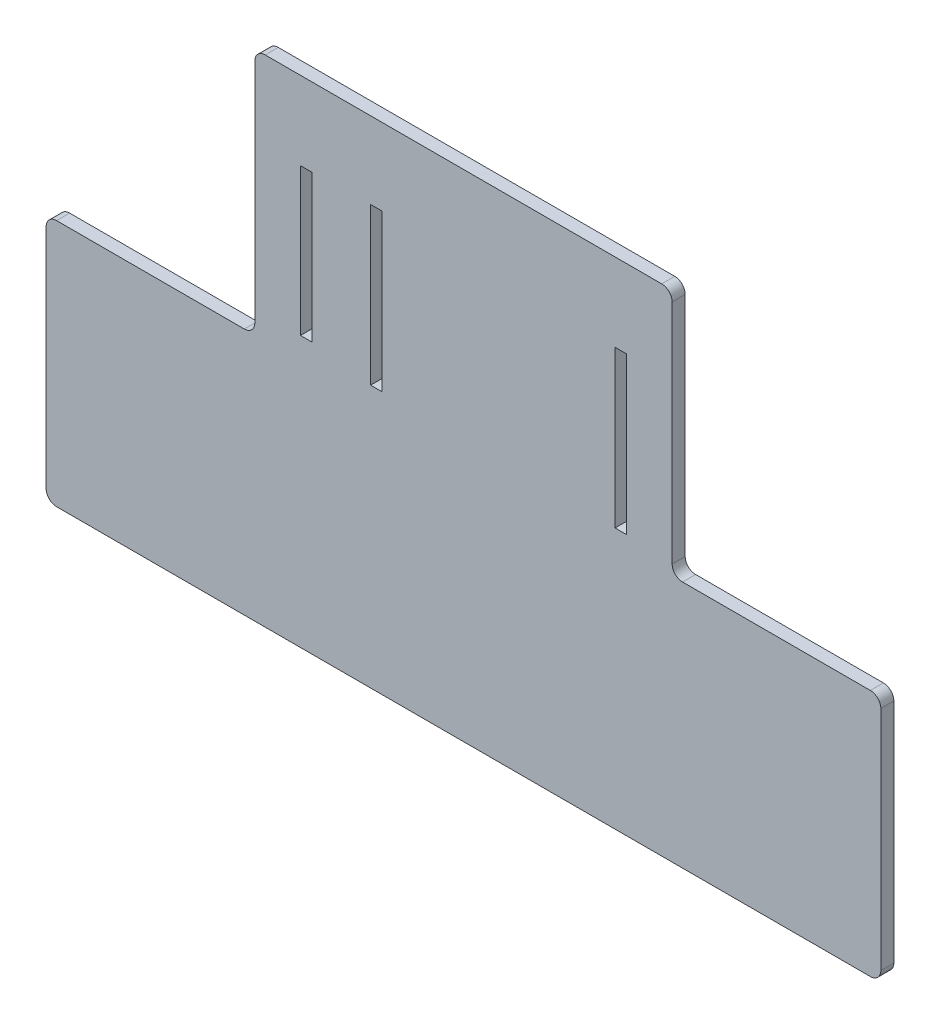
ISO-10303-21;
HEADER;
FILE_DESCRIPTION(('STEP AP214'),'2;1');
FILE_NAME('part.step','',(''),(''),'','','');
FILE_SCHEMA(('AUTOMOTIVE_DESIGN { 1 0 10303 214 1 1 1 1 }'));
ENDSEC;
DATA;
#1=APPLICATION_CONTEXT('core data for automotive mechanical design processes');
#2=APPLICATION_PROTOCOL_DEFINITION('international standard','automotive_design',2000,#1);
#3=PRODUCT_CONTEXT('',#1,'mechanical');
#4=PRODUCT('Part','Part','',(#3));
#5=PRODUCT_RELATED_PRODUCT_CATEGORY('part','',(#4));
#6=PRODUCT_DEFINITION_FORMATION('','',#4);
#7=PRODUCT_DEFINITION_CONTEXT('part definition',#1,'design');
#8=PRODUCT_DEFINITION('design','',#6,#7);
#9=PRODUCT_DEFINITION_SHAPE('','',#8);
#10=(LENGTH_UNIT() NAMED_UNIT(*) SI_UNIT(.MILLI.,.METRE.));
#11=(NAMED_UNIT(*) PLANE_ANGLE_UNIT() SI_UNIT($,.RADIAN.));
#12=(NAMED_UNIT(*) SI_UNIT($,.STERADIAN.) SOLID_ANGLE_UNIT());
#13=UNCERTAINTY_MEASURE_WITH_UNIT(LENGTH_MEASURE(1.E-05),#10,'distance_accuracy_value','');
#14=(GEOMETRIC_REPRESENTATION_CONTEXT(3) GLOBAL_UNCERTAINTY_ASSIGNED_CONTEXT((#13)) GLOBAL_UNIT_ASSIGNED_CONTEXT((#10,
#11,#12)) REPRESENTATION_CONTEXT('',''));
#15=CARTESIAN_POINT('',(0.,0.,0.));
#16=DIRECTION('',(0.,0.,1.));
#17=DIRECTION('',(1.,0.,0.));
#18=AXIS2_PLACEMENT_3D('',#15,#16,#17);
#19=CARTESIAN_POINT('',(-123.965152729372,23.4645021645021,3.175));
#20=DIRECTION('',(1.,0.,0.));
#21=DIRECTION('',(0.,1.,0.));
#22=AXIS2_PLACEMENT_3D('',#19,#20,#21);
#23=PLANE('',#22);
#24=DIRECTION('',(0.,-1.,0.));
#25=VECTOR('',#24,1.);
#26=CARTESIAN_POINT('',(-123.965152729372,23.4645021645021,3.175));
#27=LINE('',#26,#25);
#28=CARTESIAN_POINT('',(-123.965152729372,20.9245021645021,3.175));
#29=VERTEX_POINT('',#28);
#30=CARTESIAN_POINT('',(-123.965152729372,-34.3204978354978,3.175));
#31=VERTEX_POINT('',#30);
#32=EDGE_CURVE('E307',#29,#31,#27,.T.);
#33=ORIENTED_EDGE('',*,*,#32,.F.);
#34=DIRECTION('',(0.,0.,-1.));
#35=VECTOR('',#34,1.);
#36=CARTESIAN_POINT('',(-123.965152729372,20.9245021645021,3.175));
#37=LINE('',#36,#35);
#38=CARTESIAN_POINT('',(-123.965152729372,20.9245021645021,0.));
#39=VERTEX_POINT('',#38);
#40=EDGE_CURVE('E395',#29,#39,#37,.T.);
#41=ORIENTED_EDGE('',*,*,#40,.T.);
#42=DIRECTION('',(0.,-1.,0.));
#43=VECTOR('',#42,1.);
#44=CARTESIAN_POINT('',(-123.965152729372,23.4645021645021,0.));
#45=LINE('',#44,#43);
#46=CARTESIAN_POINT('',(-123.965152729372,-34.3204978354978,0.));
#47=VERTEX_POINT('',#46);
#48=EDGE_CURVE('E300',#39,#47,#45,.T.);
#49=ORIENTED_EDGE('',*,*,#48,.T.);
#50=DIRECTION('',(0.,0.,-1.));
#51=VECTOR('',#50,1.);
#52=CARTESIAN_POINT('',(-123.965152729372,-34.3204978354978,3.175));
#53=LINE('',#52,#51);
#54=EDGE_CURVE('E393',#47,#31,#53,.F.);
#55=ORIENTED_EDGE('',*,*,#54,.T.);
#56=EDGE_LOOP('',(#33,#41,#49,#55));
#57=FACE_BOUND('',#56,.T.);
#58=ADVANCED_FACE('F33',(#57),#23,.F.);
#59=CARTESIAN_POINT('',(-123.965152729372,-36.8604978354979,3.175));
#60=DIRECTION('',(0.,1.,0.));
#61=DIRECTION('',(-1.,0.,0.));
#62=AXIS2_PLACEMENT_3D('',#59,#60,#61);
#63=PLANE('',#62);
#64=DIRECTION('',(1.,0.,0.));
#65=VECTOR('',#64,1.);
#66=CARTESIAN_POINT('',(-123.965152729372,-36.8604978354979,3.175));
#67=LINE('',#66,#65);
#68=CARTESIAN_POINT('',(-121.425152729372,-36.8604978354979,3.175));
#69=VERTEX_POINT('',#68);
#70=CARTESIAN_POINT('',(76.6948472706281,-36.8604978354979,3.175));
#71=VERTEX_POINT('',#70);
#72=EDGE_CURVE('E310',#69,#71,#67,.T.);
#73=ORIENTED_EDGE('',*,*,#72,.F.);
#74=DIRECTION('',(0.,0.,-1.));
#75=VECTOR('',#74,1.);
#76=CARTESIAN_POINT('',(-121.425152729372,-36.8604978354979,3.175));
#77=LINE('',#76,#75);
#78=CARTESIAN_POINT('',(-121.425152729372,-36.8604978354979,0.));
#79=VERTEX_POINT('',#78);
#80=EDGE_CURVE('E400',#69,#79,#77,.T.);
#81=ORIENTED_EDGE('',*,*,#80,.T.);
#82=DIRECTION('',(1.,0.,0.));
#83=VECTOR('',#82,1.);
#84=CARTESIAN_POINT('',(-123.965152729372,-36.8604978354979,0.));
#85=LINE('',#84,#83);
#86=CARTESIAN_POINT('',(76.6948472706281,-36.8604978354979,0.));
#87=VERTEX_POINT('',#86);
#88=EDGE_CURVE('E335',#79,#87,#85,.T.);
#89=ORIENTED_EDGE('',*,*,#88,.T.);
#90=DIRECTION('',(0.,0.,-1.));
#91=VECTOR('',#90,1.);
#92=CARTESIAN_POINT('',(76.6948472706281,-36.8604978354979,3.175));
#93=LINE('',#92,#91);
#94=EDGE_CURVE('E398',#87,#71,#93,.F.);
#95=ORIENTED_EDGE('',*,*,#94,.T.);
#96=EDGE_LOOP('',(#73,#81,#89,#95));
#97=FACE_BOUND('',#96,.T.);
#98=ADVANCED_FACE('F463',(#97),#63,.F.);
#99=CARTESIAN_POINT('',(79.2348472706281,23.4645021645021,3.175));
#100=DIRECTION('',(-1.,0.,0.));
#101=DIRECTION('',(0.,-1.,0.));
#102=AXIS2_PLACEMENT_3D('',#99,#100,#101);
#103=PLANE('',#102);
#104=DIRECTION('',(0.,1.,0.));
#105=VECTOR('',#104,1.);
#106=CARTESIAN_POINT('',(79.2348472706281,23.4645021645021,3.175));
#107=LINE('',#106,#105);
#108=CARTESIAN_POINT('',(79.2348472706281,-34.3204978354978,3.175));
#109=VERTEX_POINT('',#108);
#110=CARTESIAN_POINT('',(79.2348472706281,20.9245021645021,3.175));
#111=VERTEX_POINT('',#110);
#112=EDGE_CURVE('E314',#109,#111,#107,.T.);
#113=ORIENTED_EDGE('',*,*,#112,.F.);
#114=DIRECTION('',(0.,0.,-1.));
#115=VECTOR('',#114,1.);
#116=CARTESIAN_POINT('',(79.2348472706281,-34.3204978354979,3.175));
#117=LINE('',#116,#115);
#118=CARTESIAN_POINT('',(79.2348472706281,-34.3204978354978,0.));
#119=VERTEX_POINT('',#118);
#120=EDGE_CURVE('E405',#109,#119,#117,.T.);
#121=ORIENTED_EDGE('',*,*,#120,.T.);
#122=DIRECTION('',(0.,1.,0.));
#123=VECTOR('',#122,1.);
#124=CARTESIAN_POINT('',(79.2348472706281,23.4645021645021,0.));
#125=LINE('',#124,#123);
#126=CARTESIAN_POINT('',(79.2348472706281,20.9245021645021,0.));
#127=VERTEX_POINT('',#126);
#128=EDGE_CURVE('E338',#119,#127,#125,.T.);
#129=ORIENTED_EDGE('',*,*,#128,.T.);
#130=DIRECTION('',(0.,0.,-1.));
#131=VECTOR('',#130,1.);
#132=CARTESIAN_POINT('',(79.2348472706281,20.9245021645021,3.175));
#133=LINE('',#132,#131);
#134=EDGE_CURVE('E403',#127,#111,#133,.F.);
#135=ORIENTED_EDGE('',*,*,#134,.T.);
#136=EDGE_LOOP('',(#113,#121,#129,#135));
#137=FACE_BOUND('',#136,.T.);
#138=ADVANCED_FACE('F469',(#137),#103,.F.);
#139=CARTESIAN_POINT('',(28.4348472706281,23.4645021645021,3.175));
#140=DIRECTION('',(0.,-1.,0.));
#141=DIRECTION('',(1.,0.,0.));
#142=AXIS2_PLACEMENT_3D('',#139,#140,#141);
#143=PLANE('',#142);
#144=DIRECTION('',(-1.,0.,0.));
#145=VECTOR('',#144,1.);
#146=CARTESIAN_POINT('',(28.4348472706281,23.4645021645021,0.));
#147=LINE('',#146,#145);
#148=CARTESIAN_POINT('',(76.6948472706281,23.4645021645021,0.));
#149=VERTEX_POINT('',#148);
#150=CARTESIAN_POINT('',(30.9748472706281,23.4645021645021,0.));
#151=VERTEX_POINT('',#150);
#152=EDGE_CURVE('E341',#149,#151,#147,.T.);
#153=ORIENTED_EDGE('',*,*,#152,.T.);
#154=DIRECTION('',(0.,0.,-1.));
#155=VECTOR('',#154,1.);
#156=CARTESIAN_POINT('',(30.9748472706281,23.4645021645021,3.175));
#157=LINE('',#156,#155);
#158=CARTESIAN_POINT('',(30.9748472706281,23.4645021645021,3.175));
#159=VERTEX_POINT('',#158);
#160=EDGE_CURVE('E416',#151,#159,#157,.F.);
#161=ORIENTED_EDGE('',*,*,#160,.T.);
#162=DIRECTION('',(-1.,0.,0.));
#163=VECTOR('',#162,1.);
#164=CARTESIAN_POINT('',(28.4348472706281,23.4645021645021,3.175));
#165=LINE('',#164,#163);
#166=CARTESIAN_POINT('',(76.6948472706281,23.4645021645021,3.175));
#167=VERTEX_POINT('',#166);
#168=EDGE_CURVE('E317',#167,#159,#165,.T.);
#169=ORIENTED_EDGE('',*,*,#168,.F.);
#170=DIRECTION('',(0.,0.,-1.));
#171=VECTOR('',#170,1.);
#172=CARTESIAN_POINT('',(76.6948472706281,23.4645021645021,3.175));
#173=LINE('',#172,#171);
#174=EDGE_CURVE('E413',#167,#149,#173,.T.);
#175=ORIENTED_EDGE('',*,*,#174,.T.);
#176=EDGE_LOOP('',(#153,#161,#169,#175));
#177=FACE_BOUND('',#176,.T.);
#178=ADVANCED_FACE('F514',(#177),#143,.F.);
#179=CARTESIAN_POINT('',(28.4348472706281,83.7895021645021,3.175));
#180=DIRECTION('',(-1.,0.,0.));
#181=DIRECTION('',(0.,0.,1.));
#182=AXIS2_PLACEMENT_3D('',#179,#180,#181);
#183=PLANE('',#182);
#184=DIRECTION('',(0.,1.,0.));
#185=VECTOR('',#184,1.);
#186=CARTESIAN_POINT('',(28.4348472706281,83.7895021645021,3.175));
#187=LINE('',#186,#185);
#188=CARTESIAN_POINT('',(28.4348472706281,26.0045021645021,3.175));
#189=VERTEX_POINT('',#188);
#190=CARTESIAN_POINT('',(28.4348472706281,81.2495021645021,3.175));
#191=VERTEX_POINT('',#190);
#192=EDGE_CURVE('E320',#189,#191,#187,.T.);
#193=ORIENTED_EDGE('',*,*,#192,.F.);
#194=DIRECTION('',(0.,0.,-1.));
#195=VECTOR('',#194,1.);
#196=CARTESIAN_POINT('',(28.4348472706281,26.0045021645021,0.));
#197=LINE('',#196,#195);
#198=CARTESIAN_POINT('',(28.4348472706281,26.0045021645021,0.));
#199=VERTEX_POINT('',#198);
#200=EDGE_CURVE('E410',#189,#199,#197,.T.);
#201=ORIENTED_EDGE('',*,*,#200,.T.);
#202=DIRECTION('',(0.,1.,0.));
#203=VECTOR('',#202,1.);
#204=CARTESIAN_POINT('',(28.4348472706281,83.7895021645021,0.));
#205=LINE('',#204,#203);
#206=CARTESIAN_POINT('',(28.4348472706281,81.2495021645021,0.));
#207=VERTEX_POINT('',#206);
#208=EDGE_CURVE('E344',#199,#207,#205,.T.);
#209=ORIENTED_EDGE('',*,*,#208,.T.);
#210=DIRECTION('',(0.,0.,-1.));
#211=VECTOR('',#210,1.);
#212=CARTESIAN_POINT('',(28.4348472706281,81.2495021645021,3.175));
#213=LINE('',#212,#211);
#214=EDGE_CURVE('E408',#207,#191,#213,.F.);
#215=ORIENTED_EDGE('',*,*,#214,.T.);
#216=EDGE_LOOP('',(#193,#201,#209,#215));
#217=FACE_BOUND('',#216,.T.);
#218=ADVANCED_FACE('F521',(#217),#183,.F.);
#219=CARTESIAN_POINT('',(-73.1651527293719,83.7895021645021,3.175));
#220=DIRECTION('',(0.,-1.,0.));
#221=DIRECTION('',(1.,0.,0.));
#222=AXIS2_PLACEMENT_3D('',#219,#220,#221);
#223=PLANE('',#222);
#224=DIRECTION('',(-1.,0.,0.));
#225=VECTOR('',#224,1.);
#226=CARTESIAN_POINT('',(-73.1651527293719,83.7895021645021,0.));
#227=LINE('',#226,#225);
#228=CARTESIAN_POINT('',(25.8948472706281,83.7895021645021,0.));
#229=VERTEX_POINT('',#228);
#230=CARTESIAN_POINT('',(-70.6251527293719,83.7895021645021,0.));
#231=VERTEX_POINT('',#230);
#232=EDGE_CURVE('E347',#229,#231,#227,.T.);
#233=ORIENTED_EDGE('',*,*,#232,.T.);
#234=DIRECTION('',(0.,0.,-1.));
#235=VECTOR('',#234,1.);
#236=CARTESIAN_POINT('',(-70.6251527293719,83.7895021645021,3.175));
#237=LINE('',#236,#235);
#238=CARTESIAN_POINT('',(-70.6251527293719,83.7895021645021,3.175));
#239=VERTEX_POINT('',#238);
#240=EDGE_CURVE('E379',#231,#239,#237,.F.);
#241=ORIENTED_EDGE('',*,*,#240,.T.);
#242=DIRECTION('',(-1.,0.,0.));
#243=VECTOR('',#242,1.);
#244=CARTESIAN_POINT('',(-73.1651527293719,83.7895021645021,3.175));
#245=LINE('',#244,#243);
#246=CARTESIAN_POINT('',(25.8948472706281,83.7895021645021,3.175));
#247=VERTEX_POINT('',#246);
#248=EDGE_CURVE('E323',#247,#239,#245,.T.);
#249=ORIENTED_EDGE('',*,*,#248,.F.);
#250=DIRECTION('',(0.,0.,-1.));
#251=VECTOR('',#250,1.);
#252=CARTESIAN_POINT('',(25.8948472706281,83.7895021645021,3.175));
#253=LINE('',#252,#251);
#254=EDGE_CURVE('E376',#247,#229,#253,.T.);
#255=ORIENTED_EDGE('',*,*,#254,.T.);
#256=EDGE_LOOP('',(#233,#241,#249,#255));
#257=FACE_BOUND('',#256,.T.);
#258=ADVANCED_FACE('F528',(#257),#223,.F.);
#259=CARTESIAN_POINT('',(-73.1651527293719,83.7895021645021,3.175));
#260=DIRECTION('',(1.,0.,0.));
#261=DIRECTION('',(0.,0.,-1.));
#262=AXIS2_PLACEMENT_3D('',#259,#260,#261);
#263=PLANE('',#262);
#264=DIRECTION('',(0.,-1.,0.));
#265=VECTOR('',#264,1.);
#266=CARTESIAN_POINT('',(-73.1651527293719,83.7895021645021,0.));
#267=LINE('',#266,#265);
#268=CARTESIAN_POINT('',(-73.1651527293719,81.2495021645021,0.));
#269=VERTEX_POINT('',#268);
#270=CARTESIAN_POINT('',(-73.1651527293719,26.0045021645022,0.));
#271=VERTEX_POINT('',#270);
#272=EDGE_CURVE('E350',#269,#271,#267,.T.);
#273=ORIENTED_EDGE('',*,*,#272,.T.);
#274=DIRECTION('',(0.,0.,-1.));
#275=VECTOR('',#274,1.);
#276=CARTESIAN_POINT('',(-73.1651527293719,26.0045021645021,3.175));
#277=LINE('',#276,#275);
#278=CARTESIAN_POINT('',(-73.1651527293719,26.0045021645022,3.175));
#279=VERTEX_POINT('',#278);
#280=EDGE_CURVE('E362',#271,#279,#277,.F.);
#281=ORIENTED_EDGE('',*,*,#280,.T.);
#282=DIRECTION('',(0.,-1.,0.));
#283=VECTOR('',#282,1.);
#284=CARTESIAN_POINT('',(-73.1651527293719,83.7895021645021,3.175));
#285=LINE('',#284,#283);
#286=CARTESIAN_POINT('',(-73.1651527293719,81.2495021645021,3.175));
#287=VERTEX_POINT('',#286);
#288=EDGE_CURVE('E326',#287,#279,#285,.T.);
#289=ORIENTED_EDGE('',*,*,#288,.F.);
#290=DIRECTION('',(0.,0.,-1.));
#291=VECTOR('',#290,1.);
#292=CARTESIAN_POINT('',(-73.1651527293719,81.2495021645021,3.175));
#293=LINE('',#292,#291);
#294=EDGE_CURVE('E359',#287,#269,#293,.T.);
#295=ORIENTED_EDGE('',*,*,#294,.T.);
#296=EDGE_LOOP('',(#273,#281,#289,#295));
#297=FACE_BOUND('',#296,.T.);
#298=ADVANCED_FACE('F535',(#297),#263,.F.);
#299=CARTESIAN_POINT('',(-123.965152729372,23.4645021645021,3.175));
#300=DIRECTION('',(0.,-1.,0.));
#301=DIRECTION('',(0.,0.,-1.));
#302=AXIS2_PLACEMENT_3D('',#299,#300,#301);
#303=PLANE('',#302);
#304=DIRECTION('',(-1.,0.,0.));
#305=VECTOR('',#304,1.);
#306=CARTESIAN_POINT('',(-123.965152729372,23.4645021645021,3.175));
#307=LINE('',#306,#305);
#308=CARTESIAN_POINT('',(-75.7051527293719,23.4645021645021,3.175));
#309=VERTEX_POINT('',#308);
#310=CARTESIAN_POINT('',(-121.425152729372,23.4645021645021,3.175));
#311=VERTEX_POINT('',#310);
#312=EDGE_CURVE('E329',#309,#311,#307,.T.);
#313=ORIENTED_EDGE('',*,*,#312,.F.);
#314=DIRECTION('',(0.,0.,-1.));
#315=VECTOR('',#314,1.);
#316=CARTESIAN_POINT('',(-75.7051527293719,23.4645021645021,0.));
#317=LINE('',#316,#315);
#318=CARTESIAN_POINT('',(-75.7051527293719,23.4645021645021,0.));
#319=VERTEX_POINT('',#318);
#320=EDGE_CURVE('E356',#309,#319,#317,.T.);
#321=ORIENTED_EDGE('',*,*,#320,.T.);
#322=DIRECTION('',(-1.,0.,0.));
#323=VECTOR('',#322,1.);
#324=CARTESIAN_POINT('',(-123.965152729372,23.4645021645021,0.));
#325=LINE('',#324,#323);
#326=CARTESIAN_POINT('',(-121.425152729372,23.4645021645021,0.));
#327=VERTEX_POINT('',#326);
#328=EDGE_CURVE('E311',#319,#327,#325,.T.);
#329=ORIENTED_EDGE('',*,*,#328,.T.);
#330=DIRECTION('',(0.,0.,-1.));
#331=VECTOR('',#330,1.);
#332=CARTESIAN_POINT('',(-121.425152729372,23.4645021645021,3.175));
#333=LINE('',#332,#331);
#334=EDGE_CURVE('E332',#327,#311,#333,.F.);
#335=ORIENTED_EDGE('',*,*,#334,.T.);
#336=EDGE_LOOP('',(#313,#321,#329,#335));
#337=FACE_BOUND('',#336,.T.);
#338=ADVANCED_FACE('F542',(#337),#303,.F.);
#339=CARTESIAN_POINT('',(0.,0.,3.175));
#340=DIRECTION('',(0.,0.,1.));
#341=DIRECTION('',(1.,0.,0.));
#342=AXIS2_PLACEMENT_3D('',#339,#340,#341);
#343=PLANE('',#342);
#344=DIRECTION('',(0.,-1.,0.));
#345=VECTOR('',#344,1.);
#346=CARTESIAN_POINT('',(-44.9711527293719,65.0975164356922,3.175));
#347=LINE('',#346,#345);
#348=CARTESIAN_POINT('',(-44.9711527293719,65.0975164356922,3.175));
#349=VERTEX_POINT('',#348);
#350=CARTESIAN_POINT('',(-44.9711527293719,26.9975164356922,3.175));
#351=VERTEX_POINT('',#350);
#352=EDGE_CURVE('E48',#349,#351,#347,.T.);
#353=ORIENTED_EDGE('',*,*,#352,.F.);
#354=DIRECTION('',(-1.,0.,0.));
#355=VECTOR('',#354,1.);
#356=CARTESIAN_POINT('',(-44.9711527293719,65.0975164356922,3.175));
#357=LINE('',#356,#355);
#358=CARTESIAN_POINT('',(-42.1771527293719,65.0975164356922,3.175));
#359=VERTEX_POINT('',#358);
#360=EDGE_CURVE('E236',#359,#349,#357,.T.);
#361=ORIENTED_EDGE('',*,*,#360,.F.);
#362=DIRECTION('',(0.,1.,0.));
#363=VECTOR('',#362,1.);
#364=CARTESIAN_POINT('',(-42.1771527293719,65.0975164356922,3.175));
#365=LINE('',#364,#363);
#366=CARTESIAN_POINT('',(-42.1771527293719,26.9975164356922,3.175));
#367=VERTEX_POINT('',#366);
#368=EDGE_CURVE('E239',#367,#359,#365,.T.);
#369=ORIENTED_EDGE('',*,*,#368,.F.);
#370=DIRECTION('',(1.,0.,0.));
#371=VECTOR('',#370,1.);
#372=CARTESIAN_POINT('',(-44.9711527293719,26.9975164356922,3.175));
#373=LINE('',#372,#371);
#374=EDGE_CURVE('E245',#351,#367,#373,.T.);
#375=ORIENTED_EDGE('',*,*,#374,.F.);
#376=EDGE_LOOP('',(#353,#361,#369,#375));
#377=FACE_BOUND('',#376,.T.);
#378=DIRECTION('',(0.,-1.,0.));
#379=VECTOR('',#378,1.);
#380=CARTESIAN_POINT('',(-62.0526527293719,28.9369294344677,3.175));
#381=LINE('',#380,#379);
#382=CARTESIAN_POINT('',(-62.0526527293719,64.7395021645021,3.175));
#383=VERTEX_POINT('',#382);
#384=CARTESIAN_POINT('',(-62.0526527293719,28.9369294344677,3.175));
#385=VERTEX_POINT('',#384);
#386=EDGE_CURVE('E251',#383,#385,#381,.T.);
#387=ORIENTED_EDGE('',*,*,#386,.F.);
#388=DIRECTION('',(-1.,0.,0.));
#389=VECTOR('',#388,1.);
#390=CARTESIAN_POINT('',(-62.0526527293719,64.7395021645021,3.175));
#391=LINE('',#390,#389);
#392=CARTESIAN_POINT('',(-59.2586527293719,64.7395021645021,3.175));
#393=VERTEX_POINT('',#392);
#394=EDGE_CURVE('E262',#393,#383,#391,.T.);
#395=ORIENTED_EDGE('',*,*,#394,.F.);
#396=DIRECTION('',(0.,1.,0.));
#397=VECTOR('',#396,1.);
#398=CARTESIAN_POINT('',(-59.2586527293719,28.9369294344677,3.175));
#399=LINE('',#398,#397);
#400=CARTESIAN_POINT('',(-59.2586527293719,28.9369294344677,3.175));
#401=VERTEX_POINT('',#400);
#402=EDGE_CURVE('E259',#401,#393,#399,.T.);
#403=ORIENTED_EDGE('',*,*,#402,.F.);
#404=DIRECTION('',(1.,0.,0.));
#405=VECTOR('',#404,1.);
#406=CARTESIAN_POINT('',(-62.0526527293719,28.9369294344677,3.175));
#407=LINE('',#406,#405);
#408=EDGE_CURVE('E256',#385,#401,#407,.T.);
#409=ORIENTED_EDGE('',*,*,#408,.F.);
#410=EDGE_LOOP('',(#387,#395,#403,#409));
#411=FACE_BOUND('',#410,.T.);
#412=DIRECTION('',(0.,-1.,0.));
#413=VECTOR('',#412,1.);
#414=CARTESIAN_POINT('',(14.5283472706281,64.7395021645021,3.175));
#415=LINE('',#414,#413);
#416=CARTESIAN_POINT('',(14.5283472706281,64.7395021645021,3.175));
#417=VERTEX_POINT('',#416);
#418=CARTESIAN_POINT('',(14.5283472706281,26.6395021645021,3.175));
#419=VERTEX_POINT('',#418);
#420=EDGE_CURVE('E268',#417,#419,#415,.T.);
#421=ORIENTED_EDGE('',*,*,#420,.F.);
#422=DIRECTION('',(-1.,0.,0.));
#423=VECTOR('',#422,1.);
#424=CARTESIAN_POINT('',(17.3223472706281,64.7395021645021,3.175));
#425=LINE('',#424,#423);
#426=CARTESIAN_POINT('',(17.3223472706281,64.7395021645021,3.175));
#427=VERTEX_POINT('',#426);
#428=EDGE_CURVE('E279',#427,#417,#425,.T.);
#429=ORIENTED_EDGE('',*,*,#428,.F.);
#430=DIRECTION('',(0.,1.,0.));
#431=VECTOR('',#430,1.);
#432=CARTESIAN_POINT('',(17.3223472706281,64.7395021645021,3.175));
#433=LINE('',#432,#431);
#434=CARTESIAN_POINT('',(17.3223472706281,26.6395021645021,3.175));
#435=VERTEX_POINT('',#434);
#436=EDGE_CURVE('E293',#435,#427,#433,.T.);
#437=ORIENTED_EDGE('',*,*,#436,.F.);
#438=DIRECTION('',(1.,0.,0.));
#439=VECTOR('',#438,1.);
#440=CARTESIAN_POINT('',(17.3223472706281,26.6395021645021,3.175));
#441=LINE('',#440,#439);
#442=EDGE_CURVE('E290',#419,#435,#441,.T.);
#443=ORIENTED_EDGE('',*,*,#442,.F.);
#444=EDGE_LOOP('',(#421,#429,#437,#443));
#445=FACE_BOUND('',#444,.T.);
#446=ORIENTED_EDGE('',*,*,#248,.T.);
#447=CARTESIAN_POINT('',(-70.6251527293719,81.2495021645021,3.175));
#448=DIRECTION('',(0.,0.,1.));
#449=DIRECTION('',(1.,0.,0.));
#450=AXIS2_PLACEMENT_3D('',#447,#448,#449);
#451=CIRCLE('',#450,2.54);
#452=EDGE_CURVE('E391',#239,#287,#451,.T.);
#453=ORIENTED_EDGE('',*,*,#452,.T.);
#454=ORIENTED_EDGE('',*,*,#288,.T.);
#455=CARTESIAN_POINT('',(-75.7051527293719,26.0045021645021,3.175));
#456=DIRECTION('',(0.,0.,1.));
#457=DIRECTION('',(1.,0.,0.));
#458=AXIS2_PLACEMENT_3D('',#455,#456,#457);
#459=CIRCLE('',#458,2.54);
#460=EDGE_CURVE('E420',#279,#309,#459,.F.);
#461=ORIENTED_EDGE('',*,*,#460,.T.);
#462=ORIENTED_EDGE('',*,*,#312,.T.);
#463=CARTESIAN_POINT('',(-121.425152729372,20.9245021645021,3.175));
#464=DIRECTION('',(0.,0.,1.));
#465=DIRECTION('',(1.,0.,0.));
#466=AXIS2_PLACEMENT_3D('',#463,#464,#465);
#467=CIRCLE('',#466,2.54);
#468=EDGE_CURVE('E389',#311,#29,#467,.T.);
#469=ORIENTED_EDGE('',*,*,#468,.T.);
#470=ORIENTED_EDGE('',*,*,#32,.T.);
#471=CARTESIAN_POINT('',(-121.425152729372,-34.3204978354978,3.175));
#472=DIRECTION('',(0.,0.,1.));
#473=DIRECTION('',(1.,0.,0.));
#474=AXIS2_PLACEMENT_3D('',#471,#472,#473);
#475=CIRCLE('',#474,2.54);
#476=EDGE_CURVE('E387',#31,#69,#475,.T.);
#477=ORIENTED_EDGE('',*,*,#476,.T.);
#478=ORIENTED_EDGE('',*,*,#72,.T.);
#479=CARTESIAN_POINT('',(76.6948472706281,-34.3204978354979,3.175));
#480=DIRECTION('',(0.,0.,1.));
#481=DIRECTION('',(1.,0.,0.));
#482=AXIS2_PLACEMENT_3D('',#479,#480,#481);
#483=CIRCLE('',#482,2.54);
#484=EDGE_CURVE('E385',#71,#109,#483,.T.);
#485=ORIENTED_EDGE('',*,*,#484,.T.);
#486=ORIENTED_EDGE('',*,*,#112,.T.);
#487=CARTESIAN_POINT('',(76.6948472706281,20.9245021645021,3.175));
#488=DIRECTION('',(0.,0.,1.));
#489=DIRECTION('',(1.,0.,0.));
#490=AXIS2_PLACEMENT_3D('',#487,#488,#489);
#491=CIRCLE('',#490,2.54);
#492=EDGE_CURVE('E383',#111,#167,#491,.T.);
#493=ORIENTED_EDGE('',*,*,#492,.T.);
#494=ORIENTED_EDGE('',*,*,#168,.T.);
#495=CARTESIAN_POINT('',(30.9748472706281,26.0045021645021,3.175));
#496=DIRECTION('',(0.,0.,1.));
#497=DIRECTION('',(1.,0.,0.));
#498=AXIS2_PLACEMENT_3D('',#495,#496,#497);
#499=CIRCLE('',#498,2.54);
#500=EDGE_CURVE('E424',#159,#189,#499,.F.);
#501=ORIENTED_EDGE('',*,*,#500,.T.);
#502=ORIENTED_EDGE('',*,*,#192,.T.);
#503=CARTESIAN_POINT('',(25.8948472706281,81.2495021645021,3.175));
#504=DIRECTION('',(0.,0.,1.));
#505=DIRECTION('',(1.,0.,0.));
#506=AXIS2_PLACEMENT_3D('',#503,#504,#505);
#507=CIRCLE('',#506,2.54);
#508=EDGE_CURVE('E381',#191,#247,#507,.T.);
#509=ORIENTED_EDGE('',*,*,#508,.T.);
#510=EDGE_LOOP('',(#446,#453,#454,#461,#462,#469,#470,#477,#478,#485,#486,#493,#494,#501,#502,#509));
#511=FACE_BOUND('',#510,.T.);
#512=ADVANCED_FACE('F445',(#377,#411,#445,#511),#343,.T.);
#513=CARTESIAN_POINT('',(0.,0.,0.));
#514=DIRECTION('',(0.,0.,1.));
#515=DIRECTION('',(1.,0.,0.));
#516=AXIS2_PLACEMENT_3D('',#513,#514,#515);
#517=PLANE('',#516);
#518=DIRECTION('',(-1.,0.,0.));
#519=VECTOR('',#518,1.);
#520=CARTESIAN_POINT('',(-44.9711527293719,65.0975164356922,0.));
#521=LINE('',#520,#519);
#522=CARTESIAN_POINT('',(-42.1771527293719,65.0975164356922,0.));
#523=VERTEX_POINT('',#522);
#524=CARTESIAN_POINT('',(-44.9711527293719,65.0975164356922,0.));
#525=VERTEX_POINT('',#524);
#526=EDGE_CURVE('E226',#523,#525,#521,.T.);
#527=ORIENTED_EDGE('',*,*,#526,.T.);
#528=DIRECTION('',(0.,-1.,0.));
#529=VECTOR('',#528,1.);
#530=CARTESIAN_POINT('',(-44.9711527293719,65.0975164356922,0.));
#531=LINE('',#530,#529);
#532=CARTESIAN_POINT('',(-44.9711527293719,26.9975164356922,0.));
#533=VERTEX_POINT('',#532);
#534=EDGE_CURVE('E220',#525,#533,#531,.T.);
#535=ORIENTED_EDGE('',*,*,#534,.T.);
#536=DIRECTION('',(1.,0.,0.));
#537=VECTOR('',#536,1.);
#538=CARTESIAN_POINT('',(-44.9711527293719,26.9975164356922,0.));
#539=LINE('',#538,#537);
#540=CARTESIAN_POINT('',(-42.1771527293719,26.9975164356922,0.));
#541=VERTEX_POINT('',#540);
#542=EDGE_CURVE('E229',#533,#541,#539,.T.);
#543=ORIENTED_EDGE('',*,*,#542,.T.);
#544=DIRECTION('',(0.,1.,0.));
#545=VECTOR('',#544,1.);
#546=CARTESIAN_POINT('',(-42.1771527293719,65.0975164356922,0.));
#547=LINE('',#546,#545);
#548=EDGE_CURVE('E56',#541,#523,#547,.T.);
#549=ORIENTED_EDGE('',*,*,#548,.T.);
#550=EDGE_LOOP('',(#527,#535,#543,#549));
#551=FACE_BOUND('',#550,.T.);
#552=DIRECTION('',(-1.,0.,0.));
#553=VECTOR('',#552,1.);
#554=CARTESIAN_POINT('',(0.,64.7395021645021,0.));
#555=LINE('',#554,#553);
#556=CARTESIAN_POINT('',(-59.2586527293719,64.7395021645021,0.));
#557=VERTEX_POINT('',#556);
#558=CARTESIAN_POINT('',(-62.0526527293719,64.7395021645021,0.));
#559=VERTEX_POINT('',#558);
#560=EDGE_CURVE('E41',#557,#559,#555,.T.);
#561=ORIENTED_EDGE('',*,*,#560,.T.);
#562=DIRECTION('',(0.,-1.,0.));
#563=VECTOR('',#562,1.);
#564=CARTESIAN_POINT('',(-62.0526527293719,0.,0.));
#565=LINE('',#564,#563);
#566=CARTESIAN_POINT('',(-62.0526527293719,28.9369294344677,0.));
#567=VERTEX_POINT('',#566);
#568=EDGE_CURVE('E11',#559,#567,#565,.T.);
#569=ORIENTED_EDGE('',*,*,#568,.T.);
#570=DIRECTION('',(1.,0.,0.));
#571=VECTOR('',#570,1.);
#572=CARTESIAN_POINT('',(0.,28.9369294344677,0.));
#573=LINE('',#572,#571);
#574=CARTESIAN_POINT('',(-59.2586527293719,28.9369294344677,0.));
#575=VERTEX_POINT('',#574);
#576=EDGE_CURVE('E426',#567,#575,#573,.T.);
#577=ORIENTED_EDGE('',*,*,#576,.T.);
#578=DIRECTION('',(0.,1.,0.));
#579=VECTOR('',#578,1.);
#580=CARTESIAN_POINT('',(-59.2586527293719,0.,0.));
#581=LINE('',#580,#579);
#582=EDGE_CURVE('E429',#575,#557,#581,.T.);
#583=ORIENTED_EDGE('',*,*,#582,.T.);
#584=EDGE_LOOP('',(#561,#569,#577,#583));
#585=FACE_BOUND('',#584,.T.);
#586=DIRECTION('',(-1.,0.,0.));
#587=VECTOR('',#586,1.);
#588=CARTESIAN_POINT('',(17.3223472706281,64.7395021645021,0.));
#589=LINE('',#588,#587);
#590=CARTESIAN_POINT('',(17.3223472706281,64.7395021645021,0.));
#591=VERTEX_POINT('',#590);
#592=CARTESIAN_POINT('',(14.5283472706281,64.7395021645021,0.));
#593=VERTEX_POINT('',#592);
#594=EDGE_CURVE('E285',#591,#593,#589,.T.);
#595=ORIENTED_EDGE('',*,*,#594,.T.);
#596=DIRECTION('',(0.,-1.,0.));
#597=VECTOR('',#596,1.);
#598=CARTESIAN_POINT('',(14.5283472706281,64.7395021645021,0.));
#599=LINE('',#598,#597);
#600=CARTESIAN_POINT('',(14.5283472706281,26.6395021645021,0.));
#601=VERTEX_POINT('',#600);
#602=EDGE_CURVE('E275',#593,#601,#599,.T.);
#603=ORIENTED_EDGE('',*,*,#602,.T.);
#604=DIRECTION('',(1.,0.,0.));
#605=VECTOR('',#604,1.);
#606=CARTESIAN_POINT('',(17.3223472706281,26.6395021645021,0.));
#607=LINE('',#606,#605);
#608=CARTESIAN_POINT('',(17.3223472706281,26.6395021645021,0.));
#609=VERTEX_POINT('',#608);
#610=EDGE_CURVE('E278',#601,#609,#607,.T.);
#611=ORIENTED_EDGE('',*,*,#610,.T.);
#612=DIRECTION('',(0.,1.,0.));
#613=VECTOR('',#612,1.);
#614=CARTESIAN_POINT('',(17.3223472706281,64.7395021645021,0.));
#615=LINE('',#614,#613);
#616=EDGE_CURVE('E282',#609,#591,#615,.T.);
#617=ORIENTED_EDGE('',*,*,#616,.T.);
#618=EDGE_LOOP('',(#595,#603,#611,#617));
#619=FACE_BOUND('',#618,.T.);
#620=ORIENTED_EDGE('',*,*,#272,.F.);
#621=CARTESIAN_POINT('',(-70.6251527293719,81.2495021645021,0.));
#622=DIRECTION('',(0.,0.,1.));
#623=DIRECTION('',(1.,0.,0.));
#624=AXIS2_PLACEMENT_3D('',#621,#622,#623);
#625=CIRCLE('',#624,2.54);
#626=EDGE_CURVE('E374',#269,#231,#625,.F.);
#627=ORIENTED_EDGE('',*,*,#626,.T.);
#628=ORIENTED_EDGE('',*,*,#232,.F.);
#629=CARTESIAN_POINT('',(25.8948472706281,81.2495021645021,0.));
#630=DIRECTION('',(0.,0.,1.));
#631=DIRECTION('',(1.,0.,0.));
#632=AXIS2_PLACEMENT_3D('',#629,#630,#631);
#633=CIRCLE('',#632,2.54);
#634=EDGE_CURVE('E364',#229,#207,#633,.F.);
#635=ORIENTED_EDGE('',*,*,#634,.T.);
#636=ORIENTED_EDGE('',*,*,#208,.F.);
#637=CARTESIAN_POINT('',(30.9748472706281,26.0045021645021,0.));
#638=DIRECTION('',(0.,0.,1.));
#639=DIRECTION('',(1.,0.,0.));
#640=AXIS2_PLACEMENT_3D('',#637,#638,#639);
#641=CIRCLE('',#640,2.54);
#642=EDGE_CURVE('E422',#199,#151,#641,.T.);
#643=ORIENTED_EDGE('',*,*,#642,.T.);
#644=ORIENTED_EDGE('',*,*,#152,.F.);
#645=CARTESIAN_POINT('',(76.6948472706281,20.9245021645021,0.));
#646=DIRECTION('',(0.,0.,1.));
#647=DIRECTION('',(1.,0.,0.));
#648=AXIS2_PLACEMENT_3D('',#645,#646,#647);
#649=CIRCLE('',#648,2.54);
#650=EDGE_CURVE('E366',#149,#127,#649,.F.);
#651=ORIENTED_EDGE('',*,*,#650,.T.);
#652=ORIENTED_EDGE('',*,*,#128,.F.);
#653=CARTESIAN_POINT('',(76.6948472706281,-34.3204978354979,0.));
#654=DIRECTION('',(0.,0.,1.));
#655=DIRECTION('',(1.,0.,0.));
#656=AXIS2_PLACEMENT_3D('',#653,#654,#655);
#657=CIRCLE('',#656,2.54);
#658=EDGE_CURVE('E368',#119,#87,#657,.F.);
#659=ORIENTED_EDGE('',*,*,#658,.T.);
#660=ORIENTED_EDGE('',*,*,#88,.F.);
#661=CARTESIAN_POINT('',(-121.425152729372,-34.3204978354978,0.));
#662=DIRECTION('',(0.,0.,1.));
#663=DIRECTION('',(1.,0.,0.));
#664=AXIS2_PLACEMENT_3D('',#661,#662,#663);
#665=CIRCLE('',#664,2.54);
#666=EDGE_CURVE('E370',#79,#47,#665,.F.);
#667=ORIENTED_EDGE('',*,*,#666,.T.);
#668=ORIENTED_EDGE('',*,*,#48,.F.);
#669=CARTESIAN_POINT('',(-121.425152729372,20.9245021645021,0.));
#670=DIRECTION('',(0.,0.,1.));
#671=DIRECTION('',(1.,0.,0.));
#672=AXIS2_PLACEMENT_3D('',#669,#670,#671);
#673=CIRCLE('',#672,2.54);
#674=EDGE_CURVE('E372',#39,#327,#673,.F.);
#675=ORIENTED_EDGE('',*,*,#674,.T.);
#676=ORIENTED_EDGE('',*,*,#328,.F.);
#677=CARTESIAN_POINT('',(-75.7051527293719,26.0045021645021,0.));
#678=DIRECTION('',(0.,0.,1.));
#679=DIRECTION('',(1.,0.,0.));
#680=AXIS2_PLACEMENT_3D('',#677,#678,#679);
#681=CIRCLE('',#680,2.54);
#682=EDGE_CURVE('E418',#319,#271,#681,.T.);
#683=ORIENTED_EDGE('',*,*,#682,.T.);
#684=EDGE_LOOP('',(#620,#627,#628,#635,#636,#643,#644,#651,#652,#659,#660,#667,#668,#675,#676,#683));
#685=FACE_BOUND('',#684,.T.);
#686=ADVANCED_FACE('F233',(#551,#585,#619,#685),#517,.F.);
#687=CARTESIAN_POINT('',(-75.7051527293719,26.0045021645021,3.175));
#688=DIRECTION('',(0.,0.,1.));
#689=DIRECTION('',(1.,0.,0.));
#690=AXIS2_PLACEMENT_3D('',#687,#688,#689);
#691=CYLINDRICAL_SURFACE('',#690,2.54);
#692=ORIENTED_EDGE('',*,*,#460,.F.);
#693=ORIENTED_EDGE('',*,*,#280,.F.);
#694=ORIENTED_EDGE('',*,*,#682,.F.);
#695=ORIENTED_EDGE('',*,*,#320,.F.);
#696=EDGE_LOOP('',(#692,#693,#694,#695));
#697=FACE_BOUND('',#696,.T.);
#698=ADVANCED_FACE('F475',(#697),#691,.F.);
#699=CARTESIAN_POINT('',(-70.6251527293719,81.2495021645021,3.175));
#700=DIRECTION('',(0.,0.,-1.));
#701=DIRECTION('',(-1.,0.,0.));
#702=AXIS2_PLACEMENT_3D('',#699,#700,#701);
#703=CYLINDRICAL_SURFACE('',#702,2.54);
#704=ORIENTED_EDGE('',*,*,#452,.F.);
#705=ORIENTED_EDGE('',*,*,#240,.F.);
#706=ORIENTED_EDGE('',*,*,#626,.F.);
#707=ORIENTED_EDGE('',*,*,#294,.F.);
#708=EDGE_LOOP('',(#704,#705,#706,#707));
#709=FACE_BOUND('',#708,.T.);
#710=ADVANCED_FACE('F478',(#709),#703,.T.);
#711=CARTESIAN_POINT('',(-121.425152729372,20.9245021645021,3.175));
#712=DIRECTION('',(0.,0.,-1.));
#713=DIRECTION('',(-1.,0.,0.));
#714=AXIS2_PLACEMENT_3D('',#711,#712,#713);
#715=CYLINDRICAL_SURFACE('',#714,2.54);
#716=ORIENTED_EDGE('',*,*,#468,.F.);
#717=ORIENTED_EDGE('',*,*,#334,.F.);
#718=ORIENTED_EDGE('',*,*,#674,.F.);
#719=ORIENTED_EDGE('',*,*,#40,.F.);
#720=EDGE_LOOP('',(#716,#717,#718,#719));
#721=FACE_BOUND('',#720,.T.);
#722=ADVANCED_FACE('F482',(#721),#715,.T.);
#723=CARTESIAN_POINT('',(-121.425152729372,-34.3204978354978,3.175));
#724=DIRECTION('',(0.,0.,-1.));
#725=DIRECTION('',(-1.,0.,0.));
#726=AXIS2_PLACEMENT_3D('',#723,#724,#725);
#727=CYLINDRICAL_SURFACE('',#726,2.54);
#728=ORIENTED_EDGE('',*,*,#476,.F.);
#729=ORIENTED_EDGE('',*,*,#54,.F.);
#730=ORIENTED_EDGE('',*,*,#666,.F.);
#731=ORIENTED_EDGE('',*,*,#80,.F.);
#732=EDGE_LOOP('',(#728,#729,#730,#731));
#733=FACE_BOUND('',#732,.T.);
#734=ADVANCED_FACE('F486',(#733),#727,.T.);
#735=CARTESIAN_POINT('',(76.6948472706281,-34.3204978354979,3.175));
#736=DIRECTION('',(0.,0.,-1.));
#737=DIRECTION('',(-1.,0.,0.));
#738=AXIS2_PLACEMENT_3D('',#735,#736,#737);
#739=CYLINDRICAL_SURFACE('',#738,2.54);
#740=ORIENTED_EDGE('',*,*,#484,.F.);
#741=ORIENTED_EDGE('',*,*,#94,.F.);
#742=ORIENTED_EDGE('',*,*,#658,.F.);
#743=ORIENTED_EDGE('',*,*,#120,.F.);
#744=EDGE_LOOP('',(#740,#741,#742,#743));
#745=FACE_BOUND('',#744,.T.);
#746=ADVANCED_FACE('F490',(#745),#739,.T.);
#747=CARTESIAN_POINT('',(30.9748472706281,26.0045021645021,3.175));
#748=DIRECTION('',(0.,0.,1.));
#749=DIRECTION('',(1.,0.,0.));
#750=AXIS2_PLACEMENT_3D('',#747,#748,#749);
#751=CYLINDRICAL_SURFACE('',#750,2.54);
#752=ORIENTED_EDGE('',*,*,#500,.F.);
#753=ORIENTED_EDGE('',*,*,#160,.F.);
#754=ORIENTED_EDGE('',*,*,#642,.F.);
#755=ORIENTED_EDGE('',*,*,#200,.F.);
#756=EDGE_LOOP('',(#752,#753,#754,#755));
#757=FACE_BOUND('',#756,.T.);
#758=ADVANCED_FACE('F494',(#757),#751,.F.);
#759=CARTESIAN_POINT('',(76.6948472706281,20.9245021645021,3.175));
#760=DIRECTION('',(0.,0.,-1.));
#761=DIRECTION('',(-1.,0.,0.));
#762=AXIS2_PLACEMENT_3D('',#759,#760,#761);
#763=CYLINDRICAL_SURFACE('',#762,2.54);
#764=ORIENTED_EDGE('',*,*,#492,.F.);
#765=ORIENTED_EDGE('',*,*,#134,.F.);
#766=ORIENTED_EDGE('',*,*,#650,.F.);
#767=ORIENTED_EDGE('',*,*,#174,.F.);
#768=EDGE_LOOP('',(#764,#765,#766,#767));
#769=FACE_BOUND('',#768,.T.);
#770=ADVANCED_FACE('F497',(#769),#763,.T.);
#771=CARTESIAN_POINT('',(25.8948472706281,81.2495021645021,3.175));
#772=DIRECTION('',(0.,0.,-1.));
#773=DIRECTION('',(-1.,0.,0.));
#774=AXIS2_PLACEMENT_3D('',#771,#772,#773);
#775=CYLINDRICAL_SURFACE('',#774,2.54);
#776=ORIENTED_EDGE('',*,*,#508,.F.);
#777=ORIENTED_EDGE('',*,*,#214,.F.);
#778=ORIENTED_EDGE('',*,*,#634,.F.);
#779=ORIENTED_EDGE('',*,*,#254,.F.);
#780=EDGE_LOOP('',(#776,#777,#778,#779));
#781=FACE_BOUND('',#780,.T.);
#782=ADVANCED_FACE('F35',(#781),#775,.T.);
#783=CARTESIAN_POINT('',(14.5283472706281,64.7395021645021,0.));
#784=DIRECTION('',(-1.,0.,0.));
#785=DIRECTION('',(0.,-1.,0.));
#786=AXIS2_PLACEMENT_3D('',#783,#784,#785);
#787=PLANE('',#786);
#788=ORIENTED_EDGE('',*,*,#420,.T.);
#789=DIRECTION('',(0.,0.,1.));
#790=VECTOR('',#789,1.);
#791=CARTESIAN_POINT('',(14.5283472706281,26.6395021645021,0.));
#792=LINE('',#791,#790);
#793=EDGE_CURVE('E288',#601,#419,#792,.T.);
#794=ORIENTED_EDGE('',*,*,#793,.F.);
#795=ORIENTED_EDGE('',*,*,#602,.F.);
#796=DIRECTION('',(0.,0.,1.));
#797=VECTOR('',#796,1.);
#798=CARTESIAN_POINT('',(14.5283472706281,64.7395021645021,0.));
#799=LINE('',#798,#797);
#800=EDGE_CURVE('E298',#593,#417,#799,.T.);
#801=ORIENTED_EDGE('',*,*,#800,.T.);
#802=EDGE_LOOP('',(#788,#794,#795,#801));
#803=FACE_BOUND('',#802,.T.);
#804=ADVANCED_FACE('F504',(#803),#787,.F.);
#805=CARTESIAN_POINT('',(17.3223472706281,64.7395021645021,0.));
#806=DIRECTION('',(0.,1.,0.));
#807=DIRECTION('',(0.,0.,1.));
#808=AXIS2_PLACEMENT_3D('',#805,#806,#807);
#809=PLANE('',#808);
#810=ORIENTED_EDGE('',*,*,#428,.T.);
#811=ORIENTED_EDGE('',*,*,#800,.F.);
#812=ORIENTED_EDGE('',*,*,#594,.F.);
#813=DIRECTION('',(0.,0.,1.));
#814=VECTOR('',#813,1.);
#815=CARTESIAN_POINT('',(17.3223472706281,64.7395021645021,0.));
#816=LINE('',#815,#814);
#817=EDGE_CURVE('E301',#591,#427,#816,.T.);
#818=ORIENTED_EDGE('',*,*,#817,.T.);
#819=EDGE_LOOP('',(#810,#811,#812,#818));
#820=FACE_BOUND('',#819,.T.);
#821=ADVANCED_FACE('F663',(#820),#809,.F.);
#822=CARTESIAN_POINT('',(17.3223472706281,64.7395021645021,0.));
#823=DIRECTION('',(1.,0.,0.));
#824=DIRECTION('',(0.,1.,0.));
#825=AXIS2_PLACEMENT_3D('',#822,#823,#824);
#826=PLANE('',#825);
#827=ORIENTED_EDGE('',*,*,#436,.T.);
#828=ORIENTED_EDGE('',*,*,#817,.F.);
#829=ORIENTED_EDGE('',*,*,#616,.F.);
#830=DIRECTION('',(0.,0.,1.));
#831=VECTOR('',#830,1.);
#832=CARTESIAN_POINT('',(17.3223472706281,26.6395021645021,0.));
#833=LINE('',#832,#831);
#834=EDGE_CURVE('E303',#609,#435,#833,.T.);
#835=ORIENTED_EDGE('',*,*,#834,.T.);
#836=EDGE_LOOP('',(#827,#828,#829,#835));
#837=FACE_BOUND('',#836,.T.);
#838=ADVANCED_FACE('F659',(#837),#826,.F.);
#839=CARTESIAN_POINT('',(17.3223472706281,26.6395021645021,0.));
#840=DIRECTION('',(0.,-1.,0.));
#841=DIRECTION('',(0.,0.,-1.));
#842=AXIS2_PLACEMENT_3D('',#839,#840,#841);
#843=PLANE('',#842);
#844=ORIENTED_EDGE('',*,*,#442,.T.);
#845=ORIENTED_EDGE('',*,*,#834,.F.);
#846=ORIENTED_EDGE('',*,*,#610,.F.);
#847=ORIENTED_EDGE('',*,*,#793,.T.);
#848=EDGE_LOOP('',(#844,#845,#846,#847));
#849=FACE_BOUND('',#848,.T.);
#850=ADVANCED_FACE('F655',(#849),#843,.F.);
#851=CARTESIAN_POINT('',(-62.0526527293719,28.9369294344677,-23.5000278956488));
#852=DIRECTION('',(-1.,0.,0.));
#853=DIRECTION('',(0.,0.,1.));
#854=AXIS2_PLACEMENT_3D('',#851,#852,#853);
#855=PLANE('',#854);
#856=DIRECTION('',(0.,0.,1.));
#857=VECTOR('',#856,1.);
#858=CARTESIAN_POINT('',(-62.0526527293719,64.7395021645021,-23.5000278956488));
#859=LINE('',#858,#857);
#860=EDGE_CURVE('E266',#559,#383,#859,.T.);
#861=ORIENTED_EDGE('',*,*,#860,.T.);
#862=ORIENTED_EDGE('',*,*,#386,.T.);
#863=DIRECTION('',(0.,0.,1.));
#864=VECTOR('',#863,1.);
#865=CARTESIAN_POINT('',(-62.0526527293719,28.9369294344677,-23.5000278956488));
#866=LINE('',#865,#864);
#867=EDGE_CURVE('E265',#567,#385,#866,.T.);
#868=ORIENTED_EDGE('',*,*,#867,.F.);
#869=ORIENTED_EDGE('',*,*,#568,.F.);
#870=EDGE_LOOP('',(#861,#862,#868,#869));
#871=FACE_BOUND('',#870,.T.);
#872=ADVANCED_FACE('F449',(#871),#855,.F.);
#873=CARTESIAN_POINT('',(-62.0526527293719,64.7395021645021,-23.5000278956488));
#874=DIRECTION('',(0.,1.,0.));
#875=DIRECTION('',(0.,0.,1.));
#876=AXIS2_PLACEMENT_3D('',#873,#874,#875);
#877=PLANE('',#876);
#878=DIRECTION('',(0.,0.,1.));
#879=VECTOR('',#878,1.);
#880=CARTESIAN_POINT('',(-59.2586527293719,64.7395021645021,-23.5000278956488));
#881=LINE('',#880,#879);
#882=EDGE_CURVE('E269',#557,#393,#881,.T.);
#883=ORIENTED_EDGE('',*,*,#882,.T.);
#884=ORIENTED_EDGE('',*,*,#394,.T.);
#885=ORIENTED_EDGE('',*,*,#860,.F.);
#886=ORIENTED_EDGE('',*,*,#560,.F.);
#887=EDGE_LOOP('',(#883,#884,#885,#886));
#888=FACE_BOUND('',#887,.T.);
#889=ADVANCED_FACE('F437',(#888),#877,.F.);
#890=CARTESIAN_POINT('',(-59.2586527293719,28.9369294344677,-23.5000278956488));
#891=DIRECTION('',(1.,0.,0.));
#892=DIRECTION('',(0.,0.,-1.));
#893=AXIS2_PLACEMENT_3D('',#890,#891,#892);
#894=PLANE('',#893);
#895=DIRECTION('',(0.,0.,1.));
#896=VECTOR('',#895,1.);
#897=CARTESIAN_POINT('',(-59.2586527293719,28.9369294344677,-23.5000278956488));
#898=LINE('',#897,#896);
#899=EDGE_CURVE('E271',#575,#401,#898,.T.);
#900=ORIENTED_EDGE('',*,*,#899,.T.);
#901=ORIENTED_EDGE('',*,*,#402,.T.);
#902=ORIENTED_EDGE('',*,*,#882,.F.);
#903=ORIENTED_EDGE('',*,*,#582,.F.);
#904=EDGE_LOOP('',(#900,#901,#902,#903));
#905=FACE_BOUND('',#904,.T.);
#906=ADVANCED_FACE('F439',(#905),#894,.F.);
#907=CARTESIAN_POINT('',(-62.0526527293719,28.9369294344677,-23.5000278956488));
#908=DIRECTION('',(0.,-1.,0.));
#909=DIRECTION('',(0.,0.,-1.));
#910=AXIS2_PLACEMENT_3D('',#907,#908,#909);
#911=PLANE('',#910);
#912=ORIENTED_EDGE('',*,*,#867,.T.);
#913=ORIENTED_EDGE('',*,*,#408,.T.);
#914=ORIENTED_EDGE('',*,*,#899,.F.);
#915=ORIENTED_EDGE('',*,*,#576,.F.);
#916=EDGE_LOOP('',(#912,#913,#914,#915));
#917=FACE_BOUND('',#916,.T.);
#918=ADVANCED_FACE('F451',(#917),#911,.F.);
#919=CARTESIAN_POINT('',(-44.9711527293719,65.0975164356922,0.));
#920=DIRECTION('',(-1.,0.,0.));
#921=DIRECTION('',(0.,-1.,0.));
#922=AXIS2_PLACEMENT_3D('',#919,#920,#921);
#923=PLANE('',#922);
#924=ORIENTED_EDGE('',*,*,#352,.T.);
#925=DIRECTION('',(0.,0.,1.));
#926=VECTOR('',#925,1.);
#927=CARTESIAN_POINT('',(-44.9711527293719,26.9975164356922,0.));
#928=LINE('',#927,#926);
#929=EDGE_CURVE('E216',#533,#351,#928,.T.);
#930=ORIENTED_EDGE('',*,*,#929,.F.);
#931=ORIENTED_EDGE('',*,*,#534,.F.);
#932=DIRECTION('',(0.,0.,1.));
#933=VECTOR('',#932,1.);
#934=CARTESIAN_POINT('',(-44.9711527293719,65.0975164356922,0.));
#935=LINE('',#934,#933);
#936=EDGE_CURVE('E249',#525,#349,#935,.T.);
#937=ORIENTED_EDGE('',*,*,#936,.T.);
#938=EDGE_LOOP('',(#924,#930,#931,#937));
#939=FACE_BOUND('',#938,.T.);
#940=ADVANCED_FACE('F218',(#939),#923,.F.);
#941=CARTESIAN_POINT('',(-44.9711527293719,65.0975164356922,0.));
#942=DIRECTION('',(0.,1.,0.));
#943=DIRECTION('',(0.,0.,1.));
#944=AXIS2_PLACEMENT_3D('',#941,#942,#943);
#945=PLANE('',#944);
#946=ORIENTED_EDGE('',*,*,#360,.T.);
#947=ORIENTED_EDGE('',*,*,#936,.F.);
#948=ORIENTED_EDGE('',*,*,#526,.F.);
#949=DIRECTION('',(0.,0.,1.));
#950=VECTOR('',#949,1.);
#951=CARTESIAN_POINT('',(-42.1771527293719,65.0975164356922,0.));
#952=LINE('',#951,#950);
#953=EDGE_CURVE('E252',#523,#359,#952,.T.);
#954=ORIENTED_EDGE('',*,*,#953,.T.);
#955=EDGE_LOOP('',(#946,#947,#948,#954));
#956=FACE_BOUND('',#955,.T.);
#957=ADVANCED_FACE('F458',(#956),#945,.F.);
#958=CARTESIAN_POINT('',(-42.1771527293719,65.0975164356922,0.));
#959=DIRECTION('',(1.,0.,0.));
#960=DIRECTION('',(0.,1.,0.));
#961=AXIS2_PLACEMENT_3D('',#958,#959,#960);
#962=PLANE('',#961);
#963=ORIENTED_EDGE('',*,*,#368,.T.);
#964=ORIENTED_EDGE('',*,*,#953,.F.);
#965=ORIENTED_EDGE('',*,*,#548,.F.);
#966=DIRECTION('',(0.,0.,1.));
#967=VECTOR('',#966,1.);
#968=CARTESIAN_POINT('',(-42.1771527293719,26.9975164356922,0.));
#969=LINE('',#968,#967);
#970=EDGE_CURVE('E225',#541,#367,#969,.T.);
#971=ORIENTED_EDGE('',*,*,#970,.T.);
#972=EDGE_LOOP('',(#963,#964,#965,#971));
#973=FACE_BOUND('',#972,.T.);
#974=ADVANCED_FACE('F629',(#973),#962,.F.);
#975=CARTESIAN_POINT('',(-44.9711527293719,26.9975164356922,0.));
#976=DIRECTION('',(0.,-1.,0.));
#977=DIRECTION('',(0.,0.,-1.));
#978=AXIS2_PLACEMENT_3D('',#975,#976,#977);
#979=PLANE('',#978);
#980=ORIENTED_EDGE('',*,*,#374,.T.);
#981=ORIENTED_EDGE('',*,*,#970,.F.);
#982=ORIENTED_EDGE('',*,*,#542,.F.);
#983=ORIENTED_EDGE('',*,*,#929,.T.);
#984=EDGE_LOOP('',(#980,#981,#982,#983));
#985=FACE_BOUND('',#984,.T.);
#986=ADVANCED_FACE('F230',(#985),#979,.F.);
#987=CLOSED_SHELL('',(#58,#98,#138,#178,#218,#258,#298,#338,#512,#686,#698,#710,#722,#734,#746,
#758,#770,#782,#804,#821,#838,#850,#872,#889,#906,#918,#940,#957,#974,#986));
#988=MANIFOLD_SOLID_BREP('B2',#987);
#989=ADVANCED_BREP_SHAPE_REPRESENTATION('',(#18,#988),#14);
#990=SHAPE_DEFINITION_REPRESENTATION(#9,#989);
ENDSEC;
END-ISO-10303-21;
